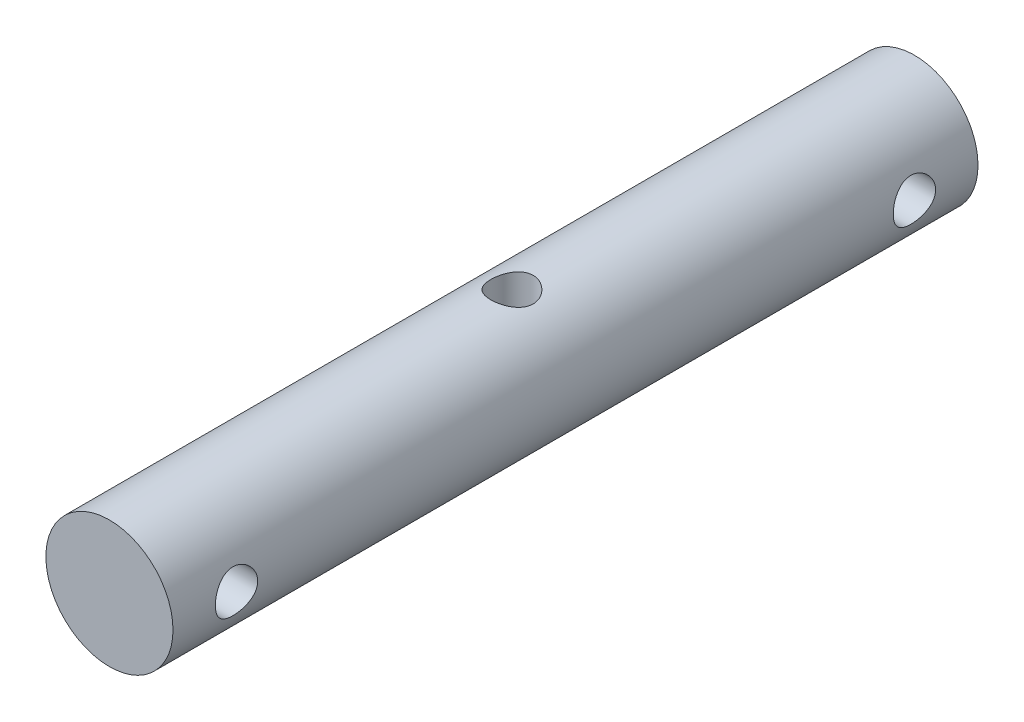
ISO-10303-21;
HEADER;
FILE_DESCRIPTION(('STEP AP214'),'2;1');
FILE_NAME('part.step','',(''),(''),'','','');
FILE_SCHEMA(('AUTOMOTIVE_DESIGN { 1 0 10303 214 1 1 1 1 }'));
ENDSEC;
DATA;
#1=APPLICATION_CONTEXT('core data for automotive mechanical design processes');
#2=APPLICATION_PROTOCOL_DEFINITION('international standard','automotive_design',2000,#1);
#3=PRODUCT_CONTEXT('',#1,'mechanical');
#4=PRODUCT('Part','Part','',(#3));
#5=PRODUCT_RELATED_PRODUCT_CATEGORY('part','',(#4));
#6=PRODUCT_DEFINITION_FORMATION('','',#4);
#7=PRODUCT_DEFINITION_CONTEXT('part definition',#1,'design');
#8=PRODUCT_DEFINITION('design','',#6,#7);
#9=PRODUCT_DEFINITION_SHAPE('','',#8);
#10=(LENGTH_UNIT() NAMED_UNIT(*) SI_UNIT(.MILLI.,.METRE.));
#11=(NAMED_UNIT(*) PLANE_ANGLE_UNIT() SI_UNIT($,.RADIAN.));
#12=(NAMED_UNIT(*) SI_UNIT($,.STERADIAN.) SOLID_ANGLE_UNIT());
#13=UNCERTAINTY_MEASURE_WITH_UNIT(LENGTH_MEASURE(1.E-05),#10,'distance_accuracy_value','');
#14=(GEOMETRIC_REPRESENTATION_CONTEXT(3) GLOBAL_UNCERTAINTY_ASSIGNED_CONTEXT((#13)) GLOBAL_UNIT_ASSIGNED_CONTEXT((#10,
#11,#12)) REPRESENTATION_CONTEXT('',''));
#15=CARTESIAN_POINT('',(0.,0.,0.));
#16=DIRECTION('',(0.,0.,1.));
#17=DIRECTION('',(1.,0.,0.));
#18=AXIS2_PLACEMENT_3D('',#15,#16,#17);
#19=CARTESIAN_POINT('',(0.,0.,38.));
#20=DIRECTION('',(0.,0.,-1.));
#21=DIRECTION('',(-1.,0.,0.));
#22=AXIS2_PLACEMENT_3D('',#19,#20,#21);
#23=CYLINDRICAL_SURFACE('',#22,3.);
#24=CARTESIAN_POINT('',(-3.,0.,36.));
#25=CARTESIAN_POINT('',(-3.00000015300943,-0.0545633628867231,36.0000002537316));
#26=CARTESIAN_POINT('',(-2.99849769507545,-0.10912519453855,35.9955197338728));
#27=CARTESIAN_POINT('',(-2.99265210203281,-0.216641760872971,35.9777708911828));
#28=CARTESIAN_POINT('',(-2.98830867202153,-0.269596328118817,35.9645016560511));
#29=CARTESIAN_POINT('',(-2.97725307906443,-0.372332789501774,35.9296807566159));
#30=CARTESIAN_POINT('',(-2.97054487730853,-0.422119825886032,35.9081429375407));
#31=CARTESIAN_POINT('',(-2.95544445717342,-0.517374936805323,35.8574588271617));
#32=CARTESIAN_POINT('',(-2.94705190667778,-0.562842156958703,35.8283110349974));
#33=CARTESIAN_POINT('',(-2.92914094443005,-0.649741675022263,35.7621741951412));
#34=CARTESIAN_POINT('',(-2.91959556463785,-0.691003700298305,35.7249687657395));
#35=CARTESIAN_POINT('',(-2.90060314783122,-0.766832692702081,35.6442328452934));
#36=CARTESIAN_POINT('',(-2.89115613290549,-0.801398185489461,35.6007009650715));
#37=CARTESIAN_POINT('',(-2.87313332477274,-0.863824942227857,35.5070148848035));
#38=CARTESIAN_POINT('',(-2.86459039275688,-0.891464858221029,35.4567062602679));
#39=CARTESIAN_POINT('',(-2.84975305418601,-0.937818873877719,35.3518239055415));
#40=CARTESIAN_POINT('',(-2.84345796160746,-0.956535697386762,35.2972514828373));
#41=CARTESIAN_POINT('',(-2.83411303269377,-0.983873461509162,35.1873267785033));
#42=CARTESIAN_POINT('',(-2.83096095769611,-0.992813448271768,35.1320627915109));
#43=CARTESIAN_POINT('',(-2.82795656629508,-1.00134112333448,35.0207362458441));
#44=CARTESIAN_POINT('',(-2.8281032302273,-1.00093170160472,34.9646739392908));
#45=CARTESIAN_POINT('',(-2.8315901500818,-0.991019903703416,34.856063369556));
#46=CARTESIAN_POINT('',(-2.83478415867533,-0.981933913166992,34.803471597081));
#47=CARTESIAN_POINT('',(-2.84376657724551,-0.955606162849414,34.7006065803932));
#48=CARTESIAN_POINT('',(-2.84955529784108,-0.938363426591868,34.6503336145649));
#49=CARTESIAN_POINT('',(-2.86317911131249,-0.89593905806021,34.5525872504085));
#50=CARTESIAN_POINT('',(-2.87104565793117,-0.870634048707261,34.5051719745305));
#51=CARTESIAN_POINT('',(-2.88792558575726,-0.812889106303137,34.4151290917203));
#52=CARTESIAN_POINT('',(-2.89693929790464,-0.780447112364003,34.3725028730666));
#53=CARTESIAN_POINT('',(-2.91567329167741,-0.707349332682234,34.2909084018392));
#54=CARTESIAN_POINT('',(-2.92540589354843,-0.666353150076308,34.2522473054909));
#55=CARTESIAN_POINT('',(-2.94406938387037,-0.578339569970062,34.1822687333366));
#56=CARTESIAN_POINT('',(-2.95300019538067,-0.531321595660814,34.1509519618355));
#57=CARTESIAN_POINT('',(-2.96917107937794,-0.431947613046268,34.0963036997649));
#58=CARTESIAN_POINT('',(-2.97639350008039,-0.379543276416337,34.0730545086593));
#59=CARTESIAN_POINT('',(-2.98820567144435,-0.271269083364507,34.0357968260443));
#60=CARTESIAN_POINT('',(-2.99279633654878,-0.215400438154953,34.0217851245766));
#61=CARTESIAN_POINT('',(-2.99867627071441,-0.104383829529303,34.0039443339776));
#62=CARTESIAN_POINT('',(-3.00010001833731,-0.0493095998648442,33.9997001908272));
#63=CARTESIAN_POINT('',(-2.99988902694825,0.0607750699602373,34.0003326735985));
#64=CARTESIAN_POINT('',(-2.99825480419352,0.115785519319647,34.0052077599799));
#65=CARTESIAN_POINT('',(-2.99220024717114,0.222519866304259,34.023611907736));
#66=CARTESIAN_POINT('',(-2.98786198711228,0.274292806834856,34.0368862060495));
#67=CARTESIAN_POINT('',(-2.97691846830034,0.374855958579561,34.0713934444667));
#68=CARTESIAN_POINT('',(-2.97031292046541,0.42364578850856,34.0926273994677));
#69=CARTESIAN_POINT('',(-2.95528931287427,0.518288296393322,34.1430704318409));
#70=CARTESIAN_POINT('',(-2.94682814756305,0.564029959217329,34.1724745932836));
#71=CARTESIAN_POINT('',(-2.92905253915743,0.650064830135404,34.2381941500131));
#72=CARTESIAN_POINT('',(-2.91973783591888,0.690356367794894,34.2745116560302));
#73=CARTESIAN_POINT('',(-2.90076847982472,0.766252507807013,34.3549787510083));
#74=CARTESIAN_POINT('',(-2.89111761095155,0.801560969248491,34.3994092269333));
#75=CARTESIAN_POINT('',(-2.87299973286981,0.864257522320853,34.4937715678045));
#76=CARTESIAN_POINT('',(-2.8645327335312,0.891645547920842,34.5437034786102));
#77=CARTESIAN_POINT('',(-2.84982391820308,0.937596930423359,34.6476730153066));
#78=CARTESIAN_POINT('',(-2.84357760900632,0.956178132197764,34.7017020792428));
#79=CARTESIAN_POINT('',(-2.83410832399133,0.98389466679216,34.8123786501241));
#80=CARTESIAN_POINT('',(-2.83088398622698,0.993034254961241,34.8690249654331));
#81=CARTESIAN_POINT('',(-2.82797858875071,1.00127628247038,34.9801970960132));
#82=CARTESIAN_POINT('',(-2.82812400344299,1.00087025731092,35.0346823402517));
#83=CARTESIAN_POINT('',(-2.8315126992356,0.991242293454876,35.1427650748997));
#84=CARTESIAN_POINT('',(-2.83475579595884,0.982020879458885,35.1963626179529));
#85=CARTESIAN_POINT('',(-2.84384524278943,0.955371813126979,35.3001356630127));
#86=CARTESIAN_POINT('',(-2.84964098015514,0.938103346014878,35.3503568250072));
#87=CARTESIAN_POINT('',(-2.86316398825434,0.895979365760379,35.4472274069355));
#88=CARTESIAN_POINT('',(-2.87089168765297,0.871122168553975,35.4938760311873));
#89=CARTESIAN_POINT('',(-2.8878282922406,0.813260692583245,35.5844836699237));
#90=CARTESIAN_POINT('',(-2.89708711641604,0.779948242764529,35.6282365018986));
#91=CARTESIAN_POINT('',(-2.91583356283786,0.706642883135694,35.709689813384));
#92=CARTESIAN_POINT('',(-2.92532124912518,0.66664808445149,35.747388575688));
#93=CARTESIAN_POINT('',(-2.94390030525393,0.579241556920668,35.8171444122892));
#94=CARTESIAN_POINT('',(-2.95296181801216,0.53160151349972,35.848924347751));
#95=CARTESIAN_POINT('',(-2.96925991172652,0.431357357406624,35.9039904288506));
#96=CARTESIAN_POINT('',(-2.9764969590794,0.378754518132346,35.927278745922));
#97=CARTESIAN_POINT('',(-2.98805515068532,0.272493647200972,35.9637216324887));
#98=CARTESIAN_POINT('',(-2.9924921242252,0.218987757676406,35.9772824662634));
#99=CARTESIAN_POINT('',(-2.99846407064224,0.110320416010246,35.9954202806771));
#100=CARTESIAN_POINT('',(-2.99999984531906,0.055159425568746,35.9999997434965));
#101=CARTESIAN_POINT('',(-3.,0.,36.));
#102=B_SPLINE_CURVE_WITH_KNOTS('',3,(#24,#25,#26,#27,#28,#29,#30,#31,#32,#33,#34,#35,#36,#37,
#38,#39,#40,#41,#42,#43,#44,#45,#46,#47,#48,#49,#50,#51,#52,#53,#54,#55,#56,#57,#58,#59,#60,#61,
#62,#63,#64,#65,#66,#67,#68,#69,#70,#71,#72,#73,#74,#75,#76,#77,#78,#79,#80,#81,#82,#83,#84,#85,
#86,#87,#88,#89,#90,#91,#92,#93,#94,#95,#96,#97,#98,#99,#100,#101),.UNSPECIFIED.,.T.,.F.,(4,2,2,
2,2,2,2,2,2,2,2,2,2,2,2,2,2,2,2,2,2,2,2,2,2,2,2,2,2,2,2,2,2,2,2,2,2,2,4),(0.,0.16348710602601,
0.326991185267521,0.49022267287027,0.653486377799096,0.821846842827553,0.990244332875304,
1.1634838482347,1.33667044692833,1.5040192574184,1.67131633987486,1.83096826551281,
1.99063930855481,2.15288171155131,2.31517102558208,2.48593305811367,2.65671145966618,
2.82918405650357,3.00159668877208,3.16653583175169,3.33144713164176,3.49158157978213,
3.65173645284103,3.81610399843736,3.98052180821891,4.15241022880751,4.32430008234996,
4.49584013824416,4.66730284700845,4.82995666056618,4.99260079341184,5.15215587070227,
5.31174638165787,5.47830066681614,5.64490211113588,5.8179966082491,5.99104681142265,
6.15636558363622,6.32163866027948),.UNSPECIFIED.);
#103=CARTESIAN_POINT('',(-3.,0.,36.));
#104=VERTEX_POINT('',#103);
#105=EDGE_CURVE('E35',#104,#104,#102,.T.);
#106=ORIENTED_EDGE('',*,*,#105,.T.);
#107=EDGE_LOOP('',(#106));
#108=FACE_BOUND('',#107,.T.);
#109=CARTESIAN_POINT('',(3.,0.,34.));
#110=CARTESIAN_POINT('',(3.00000015300943,-0.0545633628867231,33.9999997462684));
#111=CARTESIAN_POINT('',(2.99849769507545,-0.10912519453855,34.0044802661272));
#112=CARTESIAN_POINT('',(2.99265210203281,-0.216641760872971,34.0222291088172));
#113=CARTESIAN_POINT('',(2.98830867202153,-0.269596328118817,34.0354983439489));
#114=CARTESIAN_POINT('',(2.97725307906443,-0.372332789501774,34.070319243384));
#115=CARTESIAN_POINT('',(2.97054487730853,-0.422119825886032,34.0918570624593));
#116=CARTESIAN_POINT('',(2.95544445717342,-0.517374936805323,34.1425411728383));
#117=CARTESIAN_POINT('',(2.94705190667778,-0.562842156958703,34.1716889650026));
#118=CARTESIAN_POINT('',(2.92914094443005,-0.649741675022263,34.2378258048588));
#119=CARTESIAN_POINT('',(2.91959556463785,-0.691003700298305,34.2750312342605));
#120=CARTESIAN_POINT('',(2.90060314783122,-0.766832692702081,34.3557671547066));
#121=CARTESIAN_POINT('',(2.89115613290549,-0.801398185489461,34.3992990349285));
#122=CARTESIAN_POINT('',(2.87313332477274,-0.863824942227857,34.4929851151965));
#123=CARTESIAN_POINT('',(2.86459039275688,-0.891464858221029,34.5432937397321));
#124=CARTESIAN_POINT('',(2.84975305418601,-0.937818873877719,34.6481760944585));
#125=CARTESIAN_POINT('',(2.84345796160746,-0.956535697386762,34.7027485171627));
#126=CARTESIAN_POINT('',(2.83411303269377,-0.983873461509162,34.8126732214967));
#127=CARTESIAN_POINT('',(2.83096095769611,-0.992813448271768,34.8679372084891));
#128=CARTESIAN_POINT('',(2.82795656629508,-1.00134112333448,34.9792637541559));
#129=CARTESIAN_POINT('',(2.8281032302273,-1.00093170160472,35.0353260607092));
#130=CARTESIAN_POINT('',(2.8315901500818,-0.991019903703416,35.143936630444));
#131=CARTESIAN_POINT('',(2.83478415867533,-0.981933913166992,35.196528402919));
#132=CARTESIAN_POINT('',(2.84376657724551,-0.955606162849414,35.2993934196068));
#133=CARTESIAN_POINT('',(2.84955529784108,-0.938363426591868,35.3496663854351));
#134=CARTESIAN_POINT('',(2.86317911131249,-0.89593905806021,35.4474127495915));
#135=CARTESIAN_POINT('',(2.87104565793117,-0.870634048707261,35.4948280254695));
#136=CARTESIAN_POINT('',(2.88792558575726,-0.812889106303137,35.5848709082797));
#137=CARTESIAN_POINT('',(2.89693929790464,-0.780447112364003,35.6274971269334));
#138=CARTESIAN_POINT('',(2.91567329167741,-0.707349332682234,35.7090915981608));
#139=CARTESIAN_POINT('',(2.92540589354843,-0.666353150076308,35.7477526945091));
#140=CARTESIAN_POINT('',(2.94406938387037,-0.578339569970062,35.8177312666634));
#141=CARTESIAN_POINT('',(2.95300019538067,-0.531321595660814,35.8490480381645));
#142=CARTESIAN_POINT('',(2.96917107937794,-0.431947613046268,35.9036963002351));
#143=CARTESIAN_POINT('',(2.97639350008039,-0.379543276416337,35.9269454913407));
#144=CARTESIAN_POINT('',(2.98820567144435,-0.271269083364507,35.9642031739557));
#145=CARTESIAN_POINT('',(2.99279633654878,-0.215400438154953,35.9782148754234));
#146=CARTESIAN_POINT('',(2.99867627071441,-0.104383829529303,35.9960556660224));
#147=CARTESIAN_POINT('',(3.00010001833731,-0.0493095998648442,36.0002998091727));
#148=CARTESIAN_POINT('',(2.99988902694825,0.0607750699602373,35.9996673264015));
#149=CARTESIAN_POINT('',(2.99825480419352,0.115785519319647,35.9947922400201));
#150=CARTESIAN_POINT('',(2.99220024717114,0.222519866304259,35.976388092264));
#151=CARTESIAN_POINT('',(2.98786198711228,0.274292806834856,35.9631137939505));
#152=CARTESIAN_POINT('',(2.97691846830034,0.374855958579561,35.9286065555333));
#153=CARTESIAN_POINT('',(2.97031292046541,0.42364578850856,35.9073726005323));
#154=CARTESIAN_POINT('',(2.95528931287427,0.518288296393322,35.8569295681591));
#155=CARTESIAN_POINT('',(2.94682814756305,0.564029959217329,35.8275254067164));
#156=CARTESIAN_POINT('',(2.92905253915743,0.650064830135404,35.7618058499869));
#157=CARTESIAN_POINT('',(2.91973783591888,0.690356367794894,35.7254883439698));
#158=CARTESIAN_POINT('',(2.90076847982472,0.766252507807013,35.6450212489917));
#159=CARTESIAN_POINT('',(2.89111761095155,0.801560969248491,35.6005907730667));
#160=CARTESIAN_POINT('',(2.87299973286981,0.864257522320853,35.5062284321955));
#161=CARTESIAN_POINT('',(2.8645327335312,0.891645547920842,35.4562965213898));
#162=CARTESIAN_POINT('',(2.84982391820308,0.937596930423357,35.3523269846934));
#163=CARTESIAN_POINT('',(2.84357760900632,0.956178132197761,35.2982979207572));
#164=CARTESIAN_POINT('',(2.83410832399133,0.983894666792159,35.1876213498759));
#165=CARTESIAN_POINT('',(2.83088398622698,0.993034254961241,35.1309750345669));
#166=CARTESIAN_POINT('',(2.82797858875071,1.00127628247038,35.0198029039868));
#167=CARTESIAN_POINT('',(2.82812400344299,1.00087025731092,34.9653176597483));
#168=CARTESIAN_POINT('',(2.8315126992356,0.991242293454876,34.8572349251003));
#169=CARTESIAN_POINT('',(2.83475579595884,0.982020879458885,34.8036373820471));
#170=CARTESIAN_POINT('',(2.84384524278943,0.955371813126979,34.6998643369873));
#171=CARTESIAN_POINT('',(2.84964098015514,0.938103346014878,34.6496431749928));
#172=CARTESIAN_POINT('',(2.86316398825434,0.895979365760379,34.5527725930645));
#173=CARTESIAN_POINT('',(2.87089168765297,0.871122168553975,34.5061239688127));
#174=CARTESIAN_POINT('',(2.8878282922406,0.813260692583245,34.4155163300763));
#175=CARTESIAN_POINT('',(2.89708711641604,0.779948242764529,34.3717634981014));
#176=CARTESIAN_POINT('',(2.91583356283786,0.706642883135694,34.290310186616));
#177=CARTESIAN_POINT('',(2.92532124912518,0.66664808445149,34.252611424312));
#178=CARTESIAN_POINT('',(2.94390030525393,0.579241556920668,34.1828555877108));
#179=CARTESIAN_POINT('',(2.95296181801216,0.53160151349972,34.151075652249));
#180=CARTESIAN_POINT('',(2.96925991172652,0.431357357406624,34.0960095711494));
#181=CARTESIAN_POINT('',(2.9764969590794,0.378754518132346,34.072721254078));
#182=CARTESIAN_POINT('',(2.98805515068532,0.272493647200972,34.0362783675113));
#183=CARTESIAN_POINT('',(2.9924921242252,0.218987757676406,34.0227175337366));
#184=CARTESIAN_POINT('',(2.99846407064224,0.110320416010246,34.0045797193229));
#185=CARTESIAN_POINT('',(2.99999984531906,0.055159425568746,34.0000002565035));
#186=CARTESIAN_POINT('',(3.,0.,34.));
#187=B_SPLINE_CURVE_WITH_KNOTS('',3,(#109,#110,#111,#112,#113,#114,#115,#116,#117,#118,#119,
#120,#121,#122,#123,#124,#125,#126,#127,#128,#129,#130,#131,#132,#133,#134,#135,#136,#137,#138,
#139,#140,#141,#142,#143,#144,#145,#146,#147,#148,#149,#150,#151,#152,#153,#154,#155,#156,#157,
#158,#159,#160,#161,#162,#163,#164,#165,#166,#167,#168,#169,#170,#171,#172,#173,#174,#175,#176,
#177,#178,#179,#180,#181,#182,#183,#184,#185,#186),.UNSPECIFIED.,.T.,.F.,(4,2,2,2,2,2,2,2,2,2,2,
2,2,2,2,2,2,2,2,2,2,2,2,2,2,2,2,2,2,2,2,2,2,2,2,2,2,2,4),(0.,0.16348710602601,0.326991185267521,
0.49022267287027,0.653486377799096,0.821846842827553,0.990244332875304,1.1634838482347,
1.33667044692833,1.5040192574184,1.67131633987486,1.83096826551281,1.99063930855481,
2.15288171155131,2.31517102558208,2.48593305811367,2.65671145966618,2.82918405650357,
3.00159668877208,3.16653583175169,3.33144713164176,3.49158157978213,3.65173645284103,
3.81610399843736,3.98052180821891,4.15241022880751,4.32430008234996,4.49584013824414,
4.66730284700845,4.82995666056618,4.99260079341184,5.15215587070227,5.31174638165787,
5.47830066681614,5.64490211113588,5.8179966082491,5.99104681142265,6.15636558363622,
6.32163866027948),.UNSPECIFIED.);
#188=CARTESIAN_POINT('',(3.,0.,34.));
#189=VERTEX_POINT('',#188);
#190=EDGE_CURVE('E89',#189,#189,#187,.T.);
#191=ORIENTED_EDGE('',*,*,#190,.T.);
#192=EDGE_LOOP('',(#191));
#193=FACE_BOUND('',#192,.T.);
#194=CARTESIAN_POINT('',(-3.,0.,4.));
#195=CARTESIAN_POINT('',(-3.00000015300943,-0.0545633628867232,4.00000025373164));
#196=CARTESIAN_POINT('',(-2.99849769507545,-0.10912519453855,3.99551973387278));
#197=CARTESIAN_POINT('',(-2.99265210203281,-0.216641760872972,3.97777089118278));
#198=CARTESIAN_POINT('',(-2.98830867202153,-0.269596328118818,3.96450165605108));
#199=CARTESIAN_POINT('',(-2.97725307906443,-0.372332789501776,3.92968075661595));
#200=CARTESIAN_POINT('',(-2.97054487730853,-0.422119825886034,3.90814293754073));
#201=CARTESIAN_POINT('',(-2.95544445717342,-0.517374936805325,3.85745882716165));
#202=CARTESIAN_POINT('',(-2.94705190667778,-0.562842156958706,3.8283110349974));
#203=CARTESIAN_POINT('',(-2.92914094443005,-0.649741675022266,3.76217419514125));
#204=CARTESIAN_POINT('',(-2.91959556463785,-0.691003700298309,3.72496876573951));
#205=CARTESIAN_POINT('',(-2.90060314783121,-0.766832692702084,3.64423284529343));
#206=CARTESIAN_POINT('',(-2.89115613290549,-0.801398185489463,3.60070096507149));
#207=CARTESIAN_POINT('',(-2.87313332477274,-0.863824942227859,3.50701488480354));
#208=CARTESIAN_POINT('',(-2.86459039275688,-0.891464858221032,3.45670626026788));
#209=CARTESIAN_POINT('',(-2.84975305418601,-0.937818873877722,3.35182390554145));
#210=CARTESIAN_POINT('',(-2.84345796160746,-0.956535697386765,3.29725148283726));
#211=CARTESIAN_POINT('',(-2.83411303269377,-0.983873461509164,3.18732677850329));
#212=CARTESIAN_POINT('',(-2.83096095769611,-0.992813448271769,3.13206279151093));
#213=CARTESIAN_POINT('',(-2.82795656629508,-1.00134112333448,3.02073624584412));
#214=CARTESIAN_POINT('',(-2.8281032302273,-1.00093170160472,2.96467393929081));
#215=CARTESIAN_POINT('',(-2.8315901500818,-0.991019903703419,2.85606336955598));
#216=CARTESIAN_POINT('',(-2.83478415867533,-0.981933913166995,2.80347159708098));
#217=CARTESIAN_POINT('',(-2.84376657724551,-0.955606162849417,2.70060658039317));
#218=CARTESIAN_POINT('',(-2.84955529784108,-0.938363426591871,2.65033361456493));
#219=CARTESIAN_POINT('',(-2.86317911131249,-0.895939058060211,2.55258725040852));
#220=CARTESIAN_POINT('',(-2.87104565793117,-0.870634048707263,2.50517197453047));
#221=CARTESIAN_POINT('',(-2.88792558575726,-0.812889106303139,2.41512909172027));
#222=CARTESIAN_POINT('',(-2.89693929790464,-0.780447112364005,2.37250287306662));
#223=CARTESIAN_POINT('',(-2.91567329167741,-0.707349332682237,2.29090840183923));
#224=CARTESIAN_POINT('',(-2.92540589354843,-0.666353150076311,2.25224730549093));
#225=CARTESIAN_POINT('',(-2.94406938387037,-0.578339569970064,2.1822687333366));
#226=CARTESIAN_POINT('',(-2.95300019538067,-0.531321595660814,2.1509519618355));
#227=CARTESIAN_POINT('',(-2.96917107937794,-0.431947613046267,2.09630369976493));
#228=CARTESIAN_POINT('',(-2.97639350008039,-0.379543276416336,2.07305450865927));
#229=CARTESIAN_POINT('',(-2.98820567144435,-0.271269083364508,2.03579682604429));
#230=CARTESIAN_POINT('',(-2.99279633654878,-0.215400438154954,2.02178512457656));
#231=CARTESIAN_POINT('',(-2.99867627071441,-0.104383829529304,2.00394433397764));
#232=CARTESIAN_POINT('',(-3.00010001833731,-0.0493095998648451,1.99970019082725));
#233=CARTESIAN_POINT('',(-2.99988902694825,0.0607750699602366,2.00033267359847));
#234=CARTESIAN_POINT('',(-2.99825480419352,0.115785519319647,2.00520775997987));
#235=CARTESIAN_POINT('',(-2.99220024717114,0.222519866304259,2.02361190773597));
#236=CARTESIAN_POINT('',(-2.98786198711228,0.274292806834856,2.03688620604952));
#237=CARTESIAN_POINT('',(-2.97691846830034,0.374855958579561,2.0713934444667));
#238=CARTESIAN_POINT('',(-2.97031292046541,0.42364578850856,2.09262739946767));
#239=CARTESIAN_POINT('',(-2.95528931287427,0.518288296393322,2.1430704318409));
#240=CARTESIAN_POINT('',(-2.94682814756305,0.56402995921733,2.1724745932836));
#241=CARTESIAN_POINT('',(-2.92905253915743,0.650064830135404,2.23819415001305));
#242=CARTESIAN_POINT('',(-2.91973783591888,0.690356367794894,2.27451165603016));
#243=CARTESIAN_POINT('',(-2.90076847982472,0.766252507807014,2.35497875100826));
#244=CARTESIAN_POINT('',(-2.89111761095155,0.801560969248492,2.39940922693325));
#245=CARTESIAN_POINT('',(-2.87299973286981,0.864257522320854,2.4937715678045));
#246=CARTESIAN_POINT('',(-2.8645327335312,0.891645547920844,2.5437034786102));
#247=CARTESIAN_POINT('',(-2.84982391820308,0.937596930423361,2.6476730153066));
#248=CARTESIAN_POINT('',(-2.84357760900632,0.956178132197766,2.70170207924278));
#249=CARTESIAN_POINT('',(-2.83410832399133,0.983894666792163,2.81237865012415));
#250=CARTESIAN_POINT('',(-2.83088398622698,0.993034254961244,2.86902496543306));
#251=CARTESIAN_POINT('',(-2.82797858875071,1.00127628247038,2.98019709601321));
#252=CARTESIAN_POINT('',(-2.82812400344299,1.00087025731093,3.03468234025174));
#253=CARTESIAN_POINT('',(-2.8315126992356,0.991242293454878,3.14276507489974));
#254=CARTESIAN_POINT('',(-2.83475579595884,0.982020879458887,3.19636261795291));
#255=CARTESIAN_POINT('',(-2.84384524278943,0.95537181312698,3.30013566301267));
#256=CARTESIAN_POINT('',(-2.84964098015514,0.93810334601488,3.35035682500723));
#257=CARTESIAN_POINT('',(-2.86316398825433,0.895979365760381,3.44722740693553));
#258=CARTESIAN_POINT('',(-2.87089168765297,0.871122168553979,3.49387603118726));
#259=CARTESIAN_POINT('',(-2.8878282922406,0.813260692583249,3.58448366992369));
#260=CARTESIAN_POINT('',(-2.89708711641604,0.779948242764532,3.6282365018986));
#261=CARTESIAN_POINT('',(-2.91583356283786,0.706642883135697,3.70968981338399));
#262=CARTESIAN_POINT('',(-2.92532124912518,0.666648084451495,3.74738857568802));
#263=CARTESIAN_POINT('',(-2.94390030525393,0.579241556920674,3.81714441228924));
#264=CARTESIAN_POINT('',(-2.95296181801216,0.531601513499724,3.84892434775102));
#265=CARTESIAN_POINT('',(-2.96925991172652,0.431357357406628,3.90399042885063));
#266=CARTESIAN_POINT('',(-2.9764969590794,0.378754518132349,3.92727874592204));
#267=CARTESIAN_POINT('',(-2.98805515068532,0.272493647200974,3.96372163248868));
#268=CARTESIAN_POINT('',(-2.9924921242252,0.218987757676408,3.97728246626338));
#269=CARTESIAN_POINT('',(-2.99846407064224,0.110320416010247,3.99542028067713));
#270=CARTESIAN_POINT('',(-2.99999984531906,0.0551594255687463,3.99999974349654));
#271=CARTESIAN_POINT('',(-3.,0.,4.));
#272=B_SPLINE_CURVE_WITH_KNOTS('',3,(#194,#195,#196,#197,#198,#199,#200,#201,#202,#203,#204,
#205,#206,#207,#208,#209,#210,#211,#212,#213,#214,#215,#216,#217,#218,#219,#220,#221,#222,#223,
#224,#225,#226,#227,#228,#229,#230,#231,#232,#233,#234,#235,#236,#237,#238,#239,#240,#241,#242,
#243,#244,#245,#246,#247,#248,#249,#250,#251,#252,#253,#254,#255,#256,#257,#258,#259,#260,#261,
#262,#263,#264,#265,#266,#267,#268,#269,#270,#271),.UNSPECIFIED.,.T.,.F.,(4,2,2,2,2,2,2,2,2,2,2,
2,2,2,2,2,2,2,2,2,2,2,2,2,2,2,2,2,2,2,2,2,2,2,2,2,2,2,4),(0.,0.163487106026011,
0.326991185267521,0.490222672870274,0.6534863777991,0.82184684282756,0.990244332875303,
1.1634838482347,1.33667044692833,1.5040192574184,1.67131633987485,1.8309682655128,
1.99063930855482,2.15288171155131,2.31517102558207,2.48593305811367,2.65671145966618,
2.82918405650358,3.00159668877208,3.1665358317517,3.33144713164177,3.49158157978214,
3.65173645284104,3.81610399843737,3.98052180821891,4.15241022880752,4.32430008234997,
4.49584013824417,4.66730284700846,4.82995666056619,4.99260079341185,5.15215587070228,
5.31174638165788,5.47830066681615,5.64490211113589,5.81799660824911,5.99104681142267,
6.15636558363624,6.3216386602795),.UNSPECIFIED.);
#273=CARTESIAN_POINT('',(-3.,0.,4.));
#274=VERTEX_POINT('',#273);
#275=EDGE_CURVE('E93',#274,#274,#272,.T.);
#276=ORIENTED_EDGE('',*,*,#275,.T.);
#277=EDGE_LOOP('',(#276));
#278=FACE_BOUND('',#277,.T.);
#279=CARTESIAN_POINT('',(3.,0.,2.));
#280=CARTESIAN_POINT('',(3.00000015300943,-0.0545633628867233,1.99999974626836));
#281=CARTESIAN_POINT('',(2.99849769507545,-0.10912519453855,2.00448026612722));
#282=CARTESIAN_POINT('',(2.99265210203281,-0.216641760872972,2.02222910881722));
#283=CARTESIAN_POINT('',(2.98830867202153,-0.269596328118818,2.03549834394892));
#284=CARTESIAN_POINT('',(2.97725307906443,-0.372332789501776,2.07031924338405));
#285=CARTESIAN_POINT('',(2.97054487730853,-0.422119825886034,2.09185706245927));
#286=CARTESIAN_POINT('',(2.95544445717342,-0.517374936805325,2.14254117283835));
#287=CARTESIAN_POINT('',(2.94705190667778,-0.562842156958706,2.1716889650026));
#288=CARTESIAN_POINT('',(2.92914094443005,-0.649741675022266,2.23782580485875));
#289=CARTESIAN_POINT('',(2.91959556463785,-0.691003700298309,2.27503123426049));
#290=CARTESIAN_POINT('',(2.90060314783121,-0.766832692702084,2.35576715470657));
#291=CARTESIAN_POINT('',(2.89115613290549,-0.801398185489463,2.39929903492851));
#292=CARTESIAN_POINT('',(2.87313332477274,-0.863824942227859,2.49298511519646));
#293=CARTESIAN_POINT('',(2.86459039275688,-0.891464858221032,2.54329373973212));
#294=CARTESIAN_POINT('',(2.84975305418601,-0.937818873877722,2.64817609445855));
#295=CARTESIAN_POINT('',(2.84345796160746,-0.956535697386765,2.70274851716274));
#296=CARTESIAN_POINT('',(2.83411303269377,-0.983873461509164,2.81267322149671));
#297=CARTESIAN_POINT('',(2.83096095769611,-0.992813448271769,2.86793720848907));
#298=CARTESIAN_POINT('',(2.82795656629508,-1.00134112333448,2.97926375415588));
#299=CARTESIAN_POINT('',(2.8281032302273,-1.00093170160472,3.03532606070919));
#300=CARTESIAN_POINT('',(2.8315901500818,-0.991019903703419,3.14393663044402));
#301=CARTESIAN_POINT('',(2.83478415867533,-0.981933913166995,3.19652840291902));
#302=CARTESIAN_POINT('',(2.84376657724551,-0.955606162849417,3.29939341960683));
#303=CARTESIAN_POINT('',(2.84955529784108,-0.938363426591871,3.34966638543507));
#304=CARTESIAN_POINT('',(2.86317911131249,-0.895939058060211,3.44741274959148));
#305=CARTESIAN_POINT('',(2.87104565793117,-0.870634048707263,3.49482802546953));
#306=CARTESIAN_POINT('',(2.88792558575726,-0.812889106303139,3.58487090827973));
#307=CARTESIAN_POINT('',(2.89693929790464,-0.780447112364006,3.62749712693338));
#308=CARTESIAN_POINT('',(2.91567329167741,-0.707349332682237,3.70909159816077));
#309=CARTESIAN_POINT('',(2.92540589354843,-0.666353150076311,3.74775269450907));
#310=CARTESIAN_POINT('',(2.94406938387037,-0.578339569970064,3.8177312666634));
#311=CARTESIAN_POINT('',(2.95300019538067,-0.531321595660814,3.8490480381645));
#312=CARTESIAN_POINT('',(2.96917107937794,-0.431947613046267,3.90369630023507));
#313=CARTESIAN_POINT('',(2.97639350008039,-0.379543276416336,3.92694549134073));
#314=CARTESIAN_POINT('',(2.98820567144435,-0.271269083364507,3.96420317395571));
#315=CARTESIAN_POINT('',(2.99279633654878,-0.215400438154954,3.97821487542344));
#316=CARTESIAN_POINT('',(2.99867627071441,-0.104383829529303,3.99605566602236));
#317=CARTESIAN_POINT('',(3.00010001833731,-0.0493095998648449,4.00029980917275));
#318=CARTESIAN_POINT('',(2.99988902694825,0.0607750699602368,3.99966732640153));
#319=CARTESIAN_POINT('',(2.99825480419352,0.115785519319647,3.99479224002013));
#320=CARTESIAN_POINT('',(2.99220024717114,0.222519866304259,3.97638809226403));
#321=CARTESIAN_POINT('',(2.98786198711228,0.274292806834856,3.96311379395048));
#322=CARTESIAN_POINT('',(2.97691846830034,0.374855958579561,3.9286065555333));
#323=CARTESIAN_POINT('',(2.97031292046541,0.42364578850856,3.90737260053233));
#324=CARTESIAN_POINT('',(2.95528931287427,0.518288296393322,3.8569295681591));
#325=CARTESIAN_POINT('',(2.94682814756305,0.56402995921733,3.8275254067164));
#326=CARTESIAN_POINT('',(2.92905253915743,0.650064830135404,3.76180584998695));
#327=CARTESIAN_POINT('',(2.91973783591888,0.690356367794894,3.72548834396984));
#328=CARTESIAN_POINT('',(2.90076847982472,0.766252507807014,3.64502124899174));
#329=CARTESIAN_POINT('',(2.89111761095155,0.801560969248492,3.60059077306675));
#330=CARTESIAN_POINT('',(2.87299973286981,0.864257522320854,3.5062284321955));
#331=CARTESIAN_POINT('',(2.8645327335312,0.891645547920844,3.4562965213898));
#332=CARTESIAN_POINT('',(2.84982391820308,0.937596930423361,3.35232698469341));
#333=CARTESIAN_POINT('',(2.84357760900632,0.956178132197766,3.29829792075722));
#334=CARTESIAN_POINT('',(2.83410832399133,0.983894666792163,3.18762134987585));
#335=CARTESIAN_POINT('',(2.83088398622698,0.993034254961244,3.13097503456694));
#336=CARTESIAN_POINT('',(2.82797858875071,1.00127628247038,3.01980290398679));
#337=CARTESIAN_POINT('',(2.82812400344299,1.00087025731093,2.96531765974826));
#338=CARTESIAN_POINT('',(2.8315126992356,0.991242293454878,2.85723492510026));
#339=CARTESIAN_POINT('',(2.83475579595884,0.982020879458887,2.80363738204709));
#340=CARTESIAN_POINT('',(2.84384524278943,0.95537181312698,2.69986433698733));
#341=CARTESIAN_POINT('',(2.84964098015514,0.93810334601488,2.64964317499277));
#342=CARTESIAN_POINT('',(2.86316398825433,0.895979365760382,2.55277259306447));
#343=CARTESIAN_POINT('',(2.87089168765297,0.871122168553979,2.50612396881274));
#344=CARTESIAN_POINT('',(2.8878282922406,0.813260692583249,2.41551633007631));
#345=CARTESIAN_POINT('',(2.89708711641604,0.779948242764531,2.3717634981014));
#346=CARTESIAN_POINT('',(2.91583356283786,0.706642883135696,2.29031018661601));
#347=CARTESIAN_POINT('',(2.92532124912518,0.666648084451494,2.25261142431198));
#348=CARTESIAN_POINT('',(2.94390030525393,0.579241556920674,2.18285558771076));
#349=CARTESIAN_POINT('',(2.95296181801216,0.531601513499725,2.15107565224898));
#350=CARTESIAN_POINT('',(2.96925991172652,0.431357357406628,2.09600957114937));
#351=CARTESIAN_POINT('',(2.9764969590794,0.378754518132349,2.07272125407796));
#352=CARTESIAN_POINT('',(2.98805515068532,0.272493647200975,2.03627836751132));
#353=CARTESIAN_POINT('',(2.9924921242252,0.218987757676409,2.02271753373662));
#354=CARTESIAN_POINT('',(2.99846407064224,0.110320416010248,2.00457971932287));
#355=CARTESIAN_POINT('',(2.99999984531906,0.0551594255687466,2.00000025650346));
#356=CARTESIAN_POINT('',(3.,0.,2.));
#357=B_SPLINE_CURVE_WITH_KNOTS('',3,(#279,#280,#281,#282,#283,#284,#285,#286,#287,#288,#289,
#290,#291,#292,#293,#294,#295,#296,#297,#298,#299,#300,#301,#302,#303,#304,#305,#306,#307,#308,
#309,#310,#311,#312,#313,#314,#315,#316,#317,#318,#319,#320,#321,#322,#323,#324,#325,#326,#327,
#328,#329,#330,#331,#332,#333,#334,#335,#336,#337,#338,#339,#340,#341,#342,#343,#344,#345,#346,
#347,#348,#349,#350,#351,#352,#353,#354,#355,#356),.UNSPECIFIED.,.T.,.F.,(4,2,2,2,2,2,2,2,2,2,2,
2,2,2,2,2,2,2,2,2,2,2,2,2,2,2,2,2,2,2,2,2,2,2,2,2,2,2,4),(0.,0.163487106026011,
0.326991185267521,0.490222672870274,0.6534863777991,0.82184684282756,0.990244332875302,
1.1634838482347,1.33667044692833,1.5040192574184,1.67131633987485,1.8309682655128,
1.99063930855482,2.15288171155131,2.31517102558207,2.48593305811367,2.65671145966618,
2.82918405650358,3.00159668877208,3.1665358317517,3.33144713164177,3.49158157978214,
3.65173645284104,3.81610399843737,3.98052180821891,4.15241022880752,4.32430008234997,
4.49584013824416,4.66730284700846,4.82995666056619,4.99260079341185,5.15215587070228,
5.31174638165788,5.47830066681615,5.64490211113589,5.8179966082491,5.99104681142266,
6.15636558363624,6.3216386602795),.UNSPECIFIED.);
#358=CARTESIAN_POINT('',(3.,0.,2.));
#359=VERTEX_POINT('',#358);
#360=EDGE_CURVE('E97',#359,#359,#357,.T.);
#361=ORIENTED_EDGE('',*,*,#360,.T.);
#362=EDGE_LOOP('',(#361));
#363=FACE_BOUND('',#362,.T.);
#364=CARTESIAN_POINT('',(0.,-3.,20.));
#365=CARTESIAN_POINT('',(0.0545633628867233,-3.00000015300943,20.0000002537316));
#366=CARTESIAN_POINT('',(0.10912519453855,-2.99849769507545,19.9955197338728));
#367=CARTESIAN_POINT('',(0.216641760872972,-2.99265210203281,19.9777708911828));
#368=CARTESIAN_POINT('',(0.269596328118818,-2.98830867202153,19.9645016560511));
#369=CARTESIAN_POINT('',(0.372332789501776,-2.97725307906443,19.929680756616));
#370=CARTESIAN_POINT('',(0.422119825886034,-2.97054487730853,19.9081429375407));
#371=CARTESIAN_POINT('',(0.517374936805325,-2.95544445717342,19.8574588271617));
#372=CARTESIAN_POINT('',(0.562842156958707,-2.94705190667778,19.8283110349974));
#373=CARTESIAN_POINT('',(0.649741675022268,-2.92914094443005,19.7621741951412));
#374=CARTESIAN_POINT('',(0.691003700298311,-2.91959556463785,19.7249687657395));
#375=CARTESIAN_POINT('',(0.766832692702085,-2.90060314783121,19.6442328452934));
#376=CARTESIAN_POINT('',(0.801398185489463,-2.89115613290549,19.6007009650715));
#377=CARTESIAN_POINT('',(0.863824942227859,-2.87313332477274,19.5070148848035));
#378=CARTESIAN_POINT('',(0.891464858221032,-2.86459039275688,19.4567062602679));
#379=CARTESIAN_POINT('',(0.937818873877721,-2.84975305418601,19.3518239055415));
#380=CARTESIAN_POINT('',(0.956535697386765,-2.84345796160746,19.2972514828373));
#381=CARTESIAN_POINT('',(0.983873461509163,-2.83411303269377,19.1873267785033));
#382=CARTESIAN_POINT('',(0.992813448271769,-2.83096095769611,19.1320627915109));
#383=CARTESIAN_POINT('',(1.00134112333448,-2.82795656629507,19.0207362458441));
#384=CARTESIAN_POINT('',(1.00093170160472,-2.8281032302273,18.9646739392908));
#385=CARTESIAN_POINT('',(0.991019903703419,-2.8315901500818,18.856063369556));
#386=CARTESIAN_POINT('',(0.981933913166995,-2.83478415867533,18.803471597081));
#387=CARTESIAN_POINT('',(0.955606162849417,-2.84376657724551,18.7006065803932));
#388=CARTESIAN_POINT('',(0.938363426591871,-2.84955529784108,18.6503336145649));
#389=CARTESIAN_POINT('',(0.895939058060211,-2.86317911131249,18.5525872504085));
#390=CARTESIAN_POINT('',(0.870634048707263,-2.87104565793117,18.5051719745305));
#391=CARTESIAN_POINT('',(0.812889106303139,-2.88792558575726,18.4151290917203));
#392=CARTESIAN_POINT('',(0.780447112364006,-2.89693929790464,18.3725028730666));
#393=CARTESIAN_POINT('',(0.707349332682238,-2.91567329167741,18.2909084018392));
#394=CARTESIAN_POINT('',(0.666353150076314,-2.92540589354843,18.2522473054909));
#395=CARTESIAN_POINT('',(0.578339569970066,-2.94406938387037,18.1822687333366));
#396=CARTESIAN_POINT('',(0.531321595660815,-2.95300019538067,18.1509519618355));
#397=CARTESIAN_POINT('',(0.431947613046268,-2.96917107937794,18.0963036997649));
#398=CARTESIAN_POINT('',(0.379543276416338,-2.97639350008039,18.0730545086593));
#399=CARTESIAN_POINT('',(0.271269083364509,-2.98820567144435,18.0357968260443));
#400=CARTESIAN_POINT('',(0.215400438154955,-2.99279633654878,18.0217851245766));
#401=CARTESIAN_POINT('',(0.104383829529304,-2.99867627071441,18.0039443339776));
#402=CARTESIAN_POINT('',(0.0493095998648452,-3.00010001833731,17.9997001908273));
#403=CARTESIAN_POINT('',(-0.0607750699602371,-2.99988902694825,18.0003326735985));
#404=CARTESIAN_POINT('',(-0.115785519319648,-2.99825480419352,18.0052077599799));
#405=CARTESIAN_POINT('',(-0.22251986630426,-2.99220024717114,18.023611907736));
#406=CARTESIAN_POINT('',(-0.274292806834857,-2.98786198711228,18.0368862060495));
#407=CARTESIAN_POINT('',(-0.374855958579562,-2.97691846830034,18.0713934444667));
#408=CARTESIAN_POINT('',(-0.42364578850856,-2.97031292046541,18.0926273994677));
#409=CARTESIAN_POINT('',(-0.518288296393323,-2.95528931287427,18.1430704318409));
#410=CARTESIAN_POINT('',(-0.564029959217331,-2.94682814756305,18.1724745932836));
#411=CARTESIAN_POINT('',(-0.650064830135405,-2.92905253915743,18.2381941500131));
#412=CARTESIAN_POINT('',(-0.690356367794895,-2.91973783591888,18.2745116560302));
#413=CARTESIAN_POINT('',(-0.766252507807014,-2.90076847982472,18.3549787510083));
#414=CARTESIAN_POINT('',(-0.801560969248492,-2.89111761095155,18.3994092269332));
#415=CARTESIAN_POINT('',(-0.864257522320854,-2.87299973286981,18.4937715678045));
#416=CARTESIAN_POINT('',(-0.891645547920844,-2.8645327335312,18.5437034786102));
#417=CARTESIAN_POINT('',(-0.937596930423361,-2.84982391820308,18.6476730153066));
#418=CARTESIAN_POINT('',(-0.956178132197766,-2.84357760900632,18.7017020792428));
#419=CARTESIAN_POINT('',(-0.983894666792162,-2.83410832399133,18.8123786501241));
#420=CARTESIAN_POINT('',(-0.993034254961244,-2.83088398622698,18.8690249654331));
#421=CARTESIAN_POINT('',(-1.00127628247038,-2.82797858875071,18.9801970960132));
#422=CARTESIAN_POINT('',(-1.00087025731093,-2.82812400344299,19.0346823402517));
#423=CARTESIAN_POINT('',(-0.991242293454878,-2.8315126992356,19.1427650748997));
#424=CARTESIAN_POINT('',(-0.982020879458887,-2.83475579595884,19.1963626179529));
#425=CARTESIAN_POINT('',(-0.955371813126981,-2.84384524278943,19.3001356630127));
#426=CARTESIAN_POINT('',(-0.938103346014881,-2.84964098015514,19.3503568250072));
#427=CARTESIAN_POINT('',(-0.895979365760383,-2.86316398825433,19.4472274069355));
#428=CARTESIAN_POINT('',(-0.87112216855398,-2.87089168765296,19.4938760311873));
#429=CARTESIAN_POINT('',(-0.813260692583249,-2.8878282922406,19.5844836699237));
#430=CARTESIAN_POINT('',(-0.779948242764532,-2.89708711641604,19.6282365018986));
#431=CARTESIAN_POINT('',(-0.706642883135697,-2.91583356283786,19.709689813384));
#432=CARTESIAN_POINT('',(-0.666648084451495,-2.92532124912518,19.747388575688));
#433=CARTESIAN_POINT('',(-0.579241556920675,-2.94390030525393,19.8171444122892));
#434=CARTESIAN_POINT('',(-0.531601513499726,-2.95296181801216,19.848924347751));
#435=CARTESIAN_POINT('',(-0.431357357406628,-2.96925991172652,19.9039904288506));
#436=CARTESIAN_POINT('',(-0.378754518132348,-2.9764969590794,19.927278745922));
#437=CARTESIAN_POINT('',(-0.272493647200973,-2.98805515068532,19.9637216324887));
#438=CARTESIAN_POINT('',(-0.218987757676407,-2.9924921242252,19.9772824662634));
#439=CARTESIAN_POINT('',(-0.110320416010247,-2.99846407064224,19.9954202806771));
#440=CARTESIAN_POINT('',(-0.0551594255687462,-2.99999984531906,19.9999997434965));
#441=CARTESIAN_POINT('',(0.,-3.,20.));
#442=B_SPLINE_CURVE_WITH_KNOTS('',3,(#364,#365,#366,#367,#368,#369,#370,#371,#372,#373,#374,
#375,#376,#377,#378,#379,#380,#381,#382,#383,#384,#385,#386,#387,#388,#389,#390,#391,#392,#393,
#394,#395,#396,#397,#398,#399,#400,#401,#402,#403,#404,#405,#406,#407,#408,#409,#410,#411,#412,
#413,#414,#415,#416,#417,#418,#419,#420,#421,#422,#423,#424,#425,#426,#427,#428,#429,#430,#431,
#432,#433,#434,#435,#436,#437,#438,#439,#440,#441),.UNSPECIFIED.,.T.,.F.,(4,2,2,2,2,2,2,2,2,2,2,
2,2,2,2,2,2,2,2,2,2,2,2,2,2,2,2,2,2,2,2,2,2,2,2,2,2,2,4),(0.,0.163487106026011,
0.326991185267521,0.490222672870272,0.653486377799102,0.821846842827564,0.990244332875303,
1.1634838482347,1.33667044692833,1.5040192574184,1.67131633987485,1.8309682655128,
1.99063930855482,2.15288171155131,2.31517102558207,2.48593305811367,2.65671145966618,
2.82918405650357,3.00159668877208,3.1665358317517,3.33144713164177,3.49158157978213,
3.65173645284104,3.81610399843737,3.98052180821891,4.15241022880752,4.32430008234997,
4.49584013824416,4.66730284700846,4.82995666056619,4.99260079341185,5.15215587070228,
5.31174638165788,5.47830066681615,5.64490211113589,5.81799660824911,5.99104681142267,
6.15636558363624,6.3216386602795),.UNSPECIFIED.);
#443=CARTESIAN_POINT('',(0.,-3.,20.));
#444=VERTEX_POINT('',#443);
#445=EDGE_CURVE('E48',#444,#444,#442,.T.);
#446=ORIENTED_EDGE('',*,*,#445,.T.);
#447=EDGE_LOOP('',(#446));
#448=FACE_BOUND('',#447,.T.);
#449=CARTESIAN_POINT('',(0.,3.,20.));
#450=CARTESIAN_POINT('',(-0.0545633628867233,3.00000015300943,20.0000002537316));
#451=CARTESIAN_POINT('',(-0.10912519453855,2.99849769507545,19.9955197338728));
#452=CARTESIAN_POINT('',(-0.216641760872972,2.99265210203281,19.9777708911828));
#453=CARTESIAN_POINT('',(-0.269596328118818,2.98830867202153,19.9645016560511));
#454=CARTESIAN_POINT('',(-0.372332789501776,2.97725307906443,19.929680756616));
#455=CARTESIAN_POINT('',(-0.422119825886034,2.97054487730853,19.9081429375407));
#456=CARTESIAN_POINT('',(-0.517374936805325,2.95544445717342,19.8574588271617));
#457=CARTESIAN_POINT('',(-0.562842156958707,2.94705190667778,19.8283110349974));
#458=CARTESIAN_POINT('',(-0.649741675022268,2.92914094443005,19.7621741951412));
#459=CARTESIAN_POINT('',(-0.691003700298311,2.91959556463785,19.7249687657395));
#460=CARTESIAN_POINT('',(-0.766832692702085,2.90060314783121,19.6442328452934));
#461=CARTESIAN_POINT('',(-0.801398185489463,2.89115613290549,19.6007009650715));
#462=CARTESIAN_POINT('',(-0.863824942227859,2.87313332477274,19.5070148848035));
#463=CARTESIAN_POINT('',(-0.891464858221032,2.86459039275688,19.4567062602679));
#464=CARTESIAN_POINT('',(-0.937818873877721,2.84975305418601,19.3518239055415));
#465=CARTESIAN_POINT('',(-0.956535697386765,2.84345796160746,19.2972514828373));
#466=CARTESIAN_POINT('',(-0.983873461509163,2.83411303269377,19.1873267785033));
#467=CARTESIAN_POINT('',(-0.992813448271769,2.83096095769611,19.1320627915109));
#468=CARTESIAN_POINT('',(-1.00134112333448,2.82795656629507,19.0207362458441));
#469=CARTESIAN_POINT('',(-1.00093170160472,2.8281032302273,18.9646739392908));
#470=CARTESIAN_POINT('',(-0.991019903703419,2.8315901500818,18.856063369556));
#471=CARTESIAN_POINT('',(-0.981933913166995,2.83478415867533,18.803471597081));
#472=CARTESIAN_POINT('',(-0.955606162849417,2.84376657724551,18.7006065803932));
#473=CARTESIAN_POINT('',(-0.938363426591871,2.84955529784108,18.6503336145649));
#474=CARTESIAN_POINT('',(-0.895939058060211,2.86317911131249,18.5525872504085));
#475=CARTESIAN_POINT('',(-0.870634048707263,2.87104565793117,18.5051719745305));
#476=CARTESIAN_POINT('',(-0.812889106303139,2.88792558575726,18.4151290917203));
#477=CARTESIAN_POINT('',(-0.780447112364006,2.89693929790464,18.3725028730666));
#478=CARTESIAN_POINT('',(-0.707349332682238,2.91567329167741,18.2909084018392));
#479=CARTESIAN_POINT('',(-0.666353150076314,2.92540589354843,18.2522473054909));
#480=CARTESIAN_POINT('',(-0.578339569970066,2.94406938387037,18.1822687333366));
#481=CARTESIAN_POINT('',(-0.531321595660815,2.95300019538067,18.1509519618355));
#482=CARTESIAN_POINT('',(-0.431947613046268,2.96917107937794,18.0963036997649));
#483=CARTESIAN_POINT('',(-0.379543276416338,2.97639350008039,18.0730545086593));
#484=CARTESIAN_POINT('',(-0.271269083364509,2.98820567144435,18.0357968260443));
#485=CARTESIAN_POINT('',(-0.215400438154955,2.99279633654878,18.0217851245766));
#486=CARTESIAN_POINT('',(-0.104383829529304,2.99867627071441,18.0039443339776));
#487=CARTESIAN_POINT('',(-0.0493095998648452,3.00010001833731,17.9997001908273));
#488=CARTESIAN_POINT('',(0.0607750699602371,2.99988902694825,18.0003326735985));
#489=CARTESIAN_POINT('',(0.115785519319648,2.99825480419352,18.0052077599799));
#490=CARTESIAN_POINT('',(0.22251986630426,2.99220024717114,18.023611907736));
#491=CARTESIAN_POINT('',(0.274292806834857,2.98786198711228,18.0368862060495));
#492=CARTESIAN_POINT('',(0.374855958579562,2.97691846830034,18.0713934444667));
#493=CARTESIAN_POINT('',(0.42364578850856,2.97031292046541,18.0926273994677));
#494=CARTESIAN_POINT('',(0.518288296393323,2.95528931287427,18.1430704318409));
#495=CARTESIAN_POINT('',(0.564029959217331,2.94682814756305,18.1724745932836));
#496=CARTESIAN_POINT('',(0.650064830135405,2.92905253915743,18.2381941500131));
#497=CARTESIAN_POINT('',(0.690356367794895,2.91973783591888,18.2745116560302));
#498=CARTESIAN_POINT('',(0.766252507807014,2.90076847982472,18.3549787510083));
#499=CARTESIAN_POINT('',(0.801560969248492,2.89111761095155,18.3994092269332));
#500=CARTESIAN_POINT('',(0.864257522320854,2.87299973286981,18.4937715678045));
#501=CARTESIAN_POINT('',(0.891645547920844,2.8645327335312,18.5437034786102));
#502=CARTESIAN_POINT('',(0.937596930423361,2.84982391820308,18.6476730153066));
#503=CARTESIAN_POINT('',(0.956178132197766,2.84357760900632,18.7017020792428));
#504=CARTESIAN_POINT('',(0.983894666792162,2.83410832399133,18.8123786501241));
#505=CARTESIAN_POINT('',(0.993034254961244,2.83088398622698,18.8690249654331));
#506=CARTESIAN_POINT('',(1.00127628247038,2.82797858875071,18.9801970960132));
#507=CARTESIAN_POINT('',(1.00087025731093,2.82812400344299,19.0346823402517));
#508=CARTESIAN_POINT('',(0.991242293454878,2.8315126992356,19.1427650748997));
#509=CARTESIAN_POINT('',(0.982020879458887,2.83475579595884,19.1963626179529));
#510=CARTESIAN_POINT('',(0.955371813126981,2.84384524278943,19.3001356630127));
#511=CARTESIAN_POINT('',(0.938103346014881,2.84964098015514,19.3503568250072));
#512=CARTESIAN_POINT('',(0.895979365760383,2.86316398825433,19.4472274069355));
#513=CARTESIAN_POINT('',(0.87112216855398,2.87089168765296,19.4938760311873));
#514=CARTESIAN_POINT('',(0.813260692583249,2.8878282922406,19.5844836699237));
#515=CARTESIAN_POINT('',(0.779948242764532,2.89708711641604,19.6282365018986));
#516=CARTESIAN_POINT('',(0.706642883135697,2.91583356283786,19.709689813384));
#517=CARTESIAN_POINT('',(0.666648084451495,2.92532124912518,19.747388575688));
#518=CARTESIAN_POINT('',(0.579241556920675,2.94390030525393,19.8171444122892));
#519=CARTESIAN_POINT('',(0.531601513499726,2.95296181801216,19.848924347751));
#520=CARTESIAN_POINT('',(0.431357357406628,2.96925991172652,19.9039904288506));
#521=CARTESIAN_POINT('',(0.378754518132348,2.9764969590794,19.927278745922));
#522=CARTESIAN_POINT('',(0.272493647200973,2.98805515068532,19.9637216324887));
#523=CARTESIAN_POINT('',(0.218987757676407,2.9924921242252,19.9772824662634));
#524=CARTESIAN_POINT('',(0.110320416010247,2.99846407064224,19.9954202806771));
#525=CARTESIAN_POINT('',(0.0551594255687462,2.99999984531906,19.9999997434965));
#526=CARTESIAN_POINT('',(0.,3.,20.));
#527=B_SPLINE_CURVE_WITH_KNOTS('',3,(#449,#450,#451,#452,#453,#454,#455,#456,#457,#458,#459,
#460,#461,#462,#463,#464,#465,#466,#467,#468,#469,#470,#471,#472,#473,#474,#475,#476,#477,#478,
#479,#480,#481,#482,#483,#484,#485,#486,#487,#488,#489,#490,#491,#492,#493,#494,#495,#496,#497,
#498,#499,#500,#501,#502,#503,#504,#505,#506,#507,#508,#509,#510,#511,#512,#513,#514,#515,#516,
#517,#518,#519,#520,#521,#522,#523,#524,#525,#526),.UNSPECIFIED.,.T.,.F.,(4,2,2,2,2,2,2,2,2,2,2,
2,2,2,2,2,2,2,2,2,2,2,2,2,2,2,2,2,2,2,2,2,2,2,2,2,2,2,4),(0.,0.163487106026011,
0.326991185267521,0.490222672870272,0.653486377799102,0.821846842827564,0.990244332875303,
1.1634838482347,1.33667044692833,1.5040192574184,1.67131633987485,1.8309682655128,
1.99063930855482,2.15288171155131,2.31517102558207,2.48593305811367,2.65671145966618,
2.82918405650357,3.00159668877208,3.1665358317517,3.33144713164177,3.49158157978213,
3.65173645284104,3.81610399843737,3.98052180821891,4.15241022880752,4.32430008234997,
4.49584013824416,4.66730284700846,4.82995666056619,4.99260079341185,5.15215587070228,
5.31174638165788,5.47830066681615,5.64490211113589,5.81799660824911,5.99104681142267,
6.15636558363624,6.3216386602795),.UNSPECIFIED.);
#528=CARTESIAN_POINT('',(0.,3.,20.));
#529=VERTEX_POINT('',#528);
#530=EDGE_CURVE('E51',#529,#529,#527,.T.);
#531=ORIENTED_EDGE('',*,*,#530,.T.);
#532=EDGE_LOOP('',(#531));
#533=FACE_BOUND('',#532,.T.);
#534=CARTESIAN_POINT('',(0.,0.,38.));
#535=DIRECTION('',(0.,0.,1.));
#536=DIRECTION('',(1.,0.,0.));
#537=AXIS2_PLACEMENT_3D('',#534,#535,#536);
#538=CIRCLE('',#537,3.);
#539=CARTESIAN_POINT('',(3.,0.,38.));
#540=VERTEX_POINT('',#539);
#541=EDGE_CURVE('E10',#540,#540,#538,.T.);
#542=ORIENTED_EDGE('',*,*,#541,.F.);
#543=EDGE_LOOP('',(#542));
#544=FACE_BOUND('',#543,.T.);
#545=CARTESIAN_POINT('',(0.,0.,0.));
#546=DIRECTION('',(0.,0.,1.));
#547=DIRECTION('',(1.,0.,0.));
#548=AXIS2_PLACEMENT_3D('',#545,#546,#547);
#549=CIRCLE('',#548,3.);
#550=CARTESIAN_POINT('',(3.,0.,0.));
#551=VERTEX_POINT('',#550);
#552=EDGE_CURVE('E43',#551,#551,#549,.T.);
#553=ORIENTED_EDGE('',*,*,#552,.T.);
#554=EDGE_LOOP('',(#553));
#555=FACE_BOUND('',#554,.T.);
#556=ADVANCED_FACE('F31',(#108,#193,#278,#363,#448,#533,#544,#555),#23,.T.);
#557=CARTESIAN_POINT('',(0.,0.,38.));
#558=DIRECTION('',(0.,0.,1.));
#559=DIRECTION('',(1.,0.,0.));
#560=AXIS2_PLACEMENT_3D('',#557,#558,#559);
#561=PLANE('',#560);
#562=ORIENTED_EDGE('',*,*,#541,.T.);
#563=EDGE_LOOP('',(#562));
#564=FACE_BOUND('',#563,.T.);
#565=ADVANCED_FACE('F71',(#564),#561,.T.);
#566=CARTESIAN_POINT('',(0.,0.,0.));
#567=DIRECTION('',(0.,0.,1.));
#568=DIRECTION('',(1.,0.,0.));
#569=AXIS2_PLACEMENT_3D('',#566,#567,#568);
#570=PLANE('',#569);
#571=ORIENTED_EDGE('',*,*,#552,.F.);
#572=EDGE_LOOP('',(#571));
#573=FACE_BOUND('',#572,.T.);
#574=ADVANCED_FACE('F68',(#573),#570,.F.);
#575=CARTESIAN_POINT('',(0.,-19.,19.));
#576=DIRECTION('',(0.,1.,0.));
#577=DIRECTION('',(0.,0.,1.));
#578=AXIS2_PLACEMENT_3D('',#575,#576,#577);
#579=CYLINDRICAL_SURFACE('',#578,1.);
#580=ORIENTED_EDGE('',*,*,#530,.F.);
#581=EDGE_LOOP('',(#580));
#582=FACE_BOUND('',#581,.T.);
#583=ORIENTED_EDGE('',*,*,#445,.F.);
#584=EDGE_LOOP('',(#583));
#585=FACE_BOUND('',#584,.T.);
#586=ADVANCED_FACE('F62',(#582,#585),#579,.F.);
#587=CARTESIAN_POINT('',(-19.,0.,3.));
#588=DIRECTION('',(1.,0.,0.));
#589=DIRECTION('',(0.,0.,-1.));
#590=AXIS2_PLACEMENT_3D('',#587,#588,#589);
#591=CYLINDRICAL_SURFACE('',#590,1.);
#592=ORIENTED_EDGE('',*,*,#360,.F.);
#593=EDGE_LOOP('',(#592));
#594=FACE_BOUND('',#593,.T.);
#595=ORIENTED_EDGE('',*,*,#275,.F.);
#596=EDGE_LOOP('',(#595));
#597=FACE_BOUND('',#596,.T.);
#598=ADVANCED_FACE('F67',(#594,#597),#591,.F.);
#599=CARTESIAN_POINT('',(-19.,0.,35.));
#600=DIRECTION('',(1.,0.,0.));
#601=DIRECTION('',(0.,0.,-1.));
#602=AXIS2_PLACEMENT_3D('',#599,#600,#601);
#603=CYLINDRICAL_SURFACE('',#602,0.999999999999998);
#604=ORIENTED_EDGE('',*,*,#190,.F.);
#605=EDGE_LOOP('',(#604));
#606=FACE_BOUND('',#605,.T.);
#607=ORIENTED_EDGE('',*,*,#105,.F.);
#608=EDGE_LOOP('',(#607));
#609=FACE_BOUND('',#608,.T.);
#610=ADVANCED_FACE('F116',(#606,#609),#603,.F.);
#611=CLOSED_SHELL('',(#556,#565,#574,#586,#598,#610));
#612=MANIFOLD_SOLID_BREP('B2',#611);
#613=ADVANCED_BREP_SHAPE_REPRESENTATION('',(#18,#612),#14);
#614=SHAPE_DEFINITION_REPRESENTATION(#9,#613);
ENDSEC;
END-ISO-10303-21;
